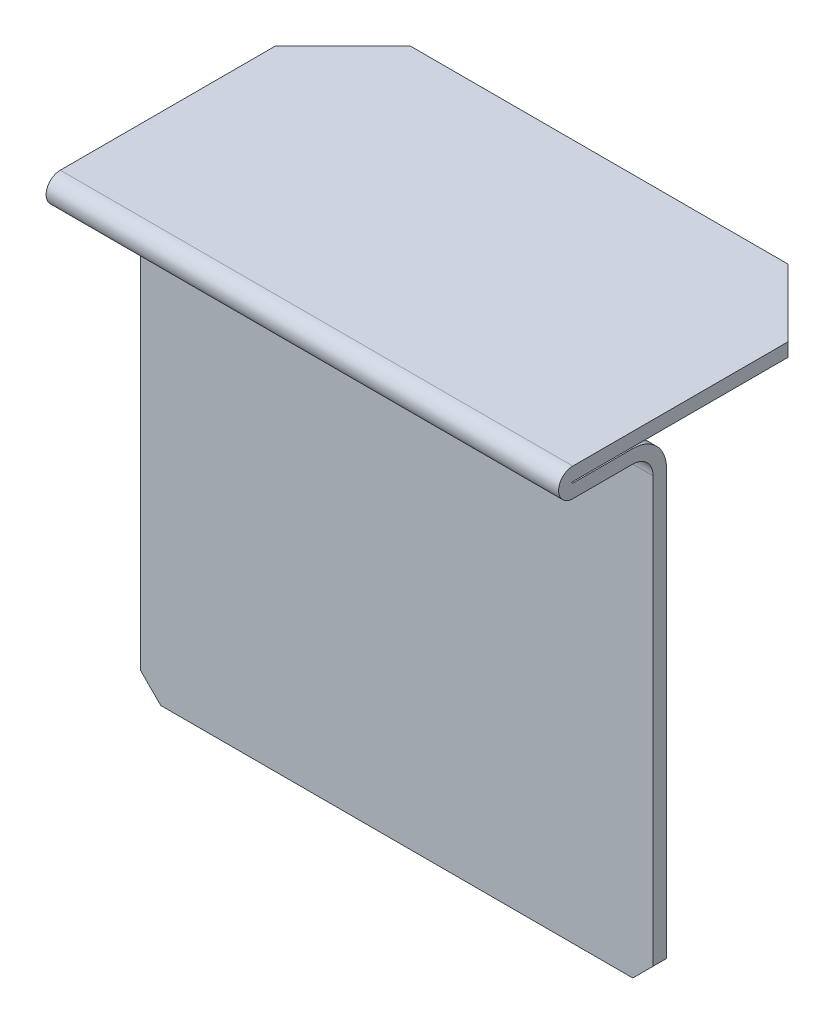
ISO-10303-21;
HEADER;
FILE_DESCRIPTION(('STEP AP214'),'2;1');
FILE_NAME('part.step','',(''),(''),'','','');
FILE_SCHEMA(('AUTOMOTIVE_DESIGN { 1 0 10303 214 1 1 1 1 }'));
ENDSEC;
DATA;
#1=APPLICATION_CONTEXT('core data for automotive mechanical design processes');
#2=APPLICATION_PROTOCOL_DEFINITION('international standard','automotive_design',2000,#1);
#3=PRODUCT_CONTEXT('',#1,'mechanical');
#4=PRODUCT('Part','Part','',(#3));
#5=PRODUCT_RELATED_PRODUCT_CATEGORY('part','',(#4));
#6=PRODUCT_DEFINITION_FORMATION('','',#4);
#7=PRODUCT_DEFINITION_CONTEXT('part definition',#1,'design');
#8=PRODUCT_DEFINITION('design','',#6,#7);
#9=PRODUCT_DEFINITION_SHAPE('','',#8);
#10=(LENGTH_UNIT() NAMED_UNIT(*) SI_UNIT(.MILLI.,.METRE.));
#11=(NAMED_UNIT(*) PLANE_ANGLE_UNIT() SI_UNIT($,.RADIAN.));
#12=(NAMED_UNIT(*) SI_UNIT($,.STERADIAN.) SOLID_ANGLE_UNIT());
#13=UNCERTAINTY_MEASURE_WITH_UNIT(LENGTH_MEASURE(1.E-05),#10,'distance_accuracy_value','');
#14=(GEOMETRIC_REPRESENTATION_CONTEXT(3) GLOBAL_UNCERTAINTY_ASSIGNED_CONTEXT((#13)) GLOBAL_UNIT_ASSIGNED_CONTEXT((#10,
#11,#12)) REPRESENTATION_CONTEXT('',''));
#15=CARTESIAN_POINT('',(0.,0.,0.));
#16=DIRECTION('',(0.,0.,1.));
#17=DIRECTION('',(1.,0.,0.));
#18=AXIS2_PLACEMENT_3D('',#15,#16,#17);
#19=CARTESIAN_POINT('',(38.,0.,0.));
#20=DIRECTION('',(0.,1.,0.));
#21=DIRECTION('',(0.,0.,1.));
#22=AXIS2_PLACEMENT_3D('',#19,#20,#21);
#23=PLANE('',#22);
#24=DIRECTION('',(-1.,0.,0.));
#25=VECTOR('',#24,1.);
#26=CARTESIAN_POINT('',(38.,0.,0.));
#27=LINE('',#26,#25);
#28=CARTESIAN_POINT('',(36.5,0.,0.));
#29=VERTEX_POINT('',#28);
#30=CARTESIAN_POINT('',(1.5,0.,0.));
#31=VERTEX_POINT('',#30);
#32=EDGE_CURVE('E195',#29,#31,#27,.T.);
#33=ORIENTED_EDGE('',*,*,#32,.T.);
#34=DIRECTION('',(0.,0.,-1.));
#35=VECTOR('',#34,1.);
#36=CARTESIAN_POINT('',(1.5,0.,0.));
#37=LINE('',#36,#35);
#38=CARTESIAN_POINT('',(1.5,0.,-1.));
#39=VERTEX_POINT('',#38);
#40=EDGE_CURVE('E263',#31,#39,#37,.T.);
#41=ORIENTED_EDGE('',*,*,#40,.T.);
#42=DIRECTION('',(-1.,0.,0.));
#43=VECTOR('',#42,1.);
#44=CARTESIAN_POINT('',(38.,0.,-1.));
#45=LINE('',#44,#43);
#46=CARTESIAN_POINT('',(36.5,0.,-1.));
#47=VERTEX_POINT('',#46);
#48=EDGE_CURVE('E170',#47,#39,#45,.T.);
#49=ORIENTED_EDGE('',*,*,#48,.F.);
#50=DIRECTION('',(0.,0.,1.));
#51=VECTOR('',#50,1.);
#52=CARTESIAN_POINT('',(36.5,0.,0.));
#53=LINE('',#52,#51);
#54=EDGE_CURVE('E261',#47,#29,#53,.T.);
#55=ORIENTED_EDGE('',*,*,#54,.T.);
#56=EDGE_LOOP('',(#33,#41,#49,#55));
#57=FACE_BOUND('',#56,.T.);
#58=ADVANCED_FACE('F37',(#57),#23,.F.);
#59=CARTESIAN_POINT('',(38.,0.,-1.));
#60=DIRECTION('',(0.,0.,1.));
#61=DIRECTION('',(0.,-1.,0.));
#62=AXIS2_PLACEMENT_3D('',#59,#60,#61);
#63=PLANE('',#62);
#64=ORIENTED_EDGE('',*,*,#48,.T.);
#65=DIRECTION('',(0.707106781186546,-0.707106781186549,0.));
#66=VECTOR('',#65,1.);
#67=CARTESIAN_POINT('',(1.5,0.,-1.));
#68=LINE('',#67,#66);
#69=CARTESIAN_POINT('',(0.,1.50000000000001,-1.));
#70=VERTEX_POINT('',#69);
#71=EDGE_CURVE('E268',#39,#70,#68,.F.);
#72=ORIENTED_EDGE('',*,*,#71,.T.);
#73=DIRECTION('',(0.,1.,0.));
#74=VECTOR('',#73,1.);
#75=CARTESIAN_POINT('',(0.,0.,-1.));
#76=LINE('',#75,#74);
#77=CARTESIAN_POINT('',(0.,33.,-1.00000000000001));
#78=VERTEX_POINT('',#77);
#79=EDGE_CURVE('E167',#70,#78,#76,.T.);
#80=ORIENTED_EDGE('',*,*,#79,.T.);
#81=DIRECTION('',(-1.,0.,0.));
#82=VECTOR('',#81,1.);
#83=CARTESIAN_POINT('',(38.,33.,-1.00000000000001));
#84=LINE('',#83,#82);
#85=CARTESIAN_POINT('',(38.,33.,-1.00000000000001));
#86=VERTEX_POINT('',#85);
#87=EDGE_CURVE('E164',#86,#78,#84,.T.);
#88=ORIENTED_EDGE('',*,*,#87,.F.);
#89=DIRECTION('',(0.,1.,0.));
#90=VECTOR('',#89,1.);
#91=CARTESIAN_POINT('',(38.,0.,-1.));
#92=LINE('',#91,#90);
#93=CARTESIAN_POINT('',(38.,1.5,-1.));
#94=VERTEX_POINT('',#93);
#95=EDGE_CURVE('E153',#94,#86,#92,.T.);
#96=ORIENTED_EDGE('',*,*,#95,.F.);
#97=DIRECTION('',(-0.707106781186549,-0.707106781186546,0.));
#98=VECTOR('',#97,1.);
#99=CARTESIAN_POINT('',(38.,1.5,-1.));
#100=LINE('',#99,#98);
#101=EDGE_CURVE('E266',#94,#47,#100,.T.);
#102=ORIENTED_EDGE('',*,*,#101,.T.);
#103=EDGE_LOOP('',(#64,#72,#80,#88,#96,#102));
#104=FACE_BOUND('',#103,.T.);
#105=ADVANCED_FACE('F166',(#104),#63,.F.);
#106=CARTESIAN_POINT('',(38.,33.,1.49999999999997));
#107=DIRECTION('',(-1.,0.,0.));
#108=DIRECTION('',(0.,0.,1.));
#109=AXIS2_PLACEMENT_3D('',#106,#107,#108);
#110=CYLINDRICAL_SURFACE('',#109,2.49999999999999);
#111=CARTESIAN_POINT('',(0.,33.,1.49999999999997));
#112=DIRECTION('',(1.,0.,0.));
#113=DIRECTION('',(0.,0.,-1.));
#114=AXIS2_PLACEMENT_3D('',#111,#112,#113);
#115=CIRCLE('',#114,2.49999999999999);
#116=CARTESIAN_POINT('',(0.,35.5,1.49999999999998));
#117=VERTEX_POINT('',#116);
#118=EDGE_CURVE('E197',#78,#117,#115,.T.);
#119=ORIENTED_EDGE('',*,*,#118,.T.);
#120=DIRECTION('',(-1.,0.,0.));
#121=VECTOR('',#120,1.);
#122=CARTESIAN_POINT('',(38.,35.5,1.49999999999998));
#123=LINE('',#122,#121);
#124=CARTESIAN_POINT('',(38.,35.5,1.49999999999998));
#125=VERTEX_POINT('',#124);
#126=EDGE_CURVE('E171',#125,#117,#123,.T.);
#127=ORIENTED_EDGE('',*,*,#126,.F.);
#128=CARTESIAN_POINT('',(38.,33.,1.49999999999997));
#129=DIRECTION('',(1.,0.,0.));
#130=DIRECTION('',(0.,0.,-1.));
#131=AXIS2_PLACEMENT_3D('',#128,#129,#130);
#132=CIRCLE('',#131,2.49999999999999);
#133=EDGE_CURVE('E157',#86,#125,#132,.T.);
#134=ORIENTED_EDGE('',*,*,#133,.F.);
#135=ORIENTED_EDGE('',*,*,#87,.T.);
#136=EDGE_LOOP('',(#119,#127,#134,#135));
#137=FACE_BOUND('',#136,.T.);
#138=ADVANCED_FACE('F173',(#137),#110,.T.);
#139=CARTESIAN_POINT('',(38.,35.5,1.49999999999998));
#140=DIRECTION('',(0.,-1.,0.));
#141=DIRECTION('',(0.,0.,-1.));
#142=AXIS2_PLACEMENT_3D('',#139,#140,#141);
#143=PLANE('',#142);
#144=DIRECTION('',(0.,0.,1.));
#145=VECTOR('',#144,1.);
#146=CARTESIAN_POINT('',(0.,35.5,1.49999999999998));
#147=LINE('',#146,#145);
#148=CARTESIAN_POINT('',(0.,35.5,5.95));
#149=VERTEX_POINT('',#148);
#150=EDGE_CURVE('E199',#117,#149,#147,.T.);
#151=ORIENTED_EDGE('',*,*,#150,.T.);
#152=DIRECTION('',(-1.,0.,0.));
#153=VECTOR('',#152,1.);
#154=CARTESIAN_POINT('',(38.,35.5,5.95));
#155=LINE('',#154,#153);
#156=CARTESIAN_POINT('',(38.,35.5,5.95));
#157=VERTEX_POINT('',#156);
#158=EDGE_CURVE('E238',#157,#149,#155,.T.);
#159=ORIENTED_EDGE('',*,*,#158,.F.);
#160=DIRECTION('',(0.,0.,1.));
#161=VECTOR('',#160,1.);
#162=CARTESIAN_POINT('',(38.,35.5,1.49999999999998));
#163=LINE('',#162,#161);
#164=EDGE_CURVE('E176',#125,#157,#163,.T.);
#165=ORIENTED_EDGE('',*,*,#164,.F.);
#166=ORIENTED_EDGE('',*,*,#126,.T.);
#167=EDGE_LOOP('',(#151,#159,#165,#166));
#168=FACE_BOUND('',#167,.T.);
#169=ADVANCED_FACE('F283',(#168),#143,.F.);
#170=CARTESIAN_POINT('',(38.,35.55,5.95));
#171=DIRECTION('',(-1.,0.,0.));
#172=DIRECTION('',(0.,0.,1.));
#173=AXIS2_PLACEMENT_3D('',#170,#171,#172);
#174=CYLINDRICAL_SURFACE('',#173,0.0500000000000014);
#175=CARTESIAN_POINT('',(0.,35.55,5.95));
#176=DIRECTION('',(-1.,0.,0.));
#177=DIRECTION('',(0.,0.,1.));
#178=AXIS2_PLACEMENT_3D('',#175,#176,#177);
#179=CIRCLE('',#178,0.0500000000000014);
#180=CARTESIAN_POINT('',(0.,35.6,5.95));
#181=VERTEX_POINT('',#180);
#182=EDGE_CURVE('E201',#149,#181,#179,.T.);
#183=ORIENTED_EDGE('',*,*,#182,.T.);
#184=DIRECTION('',(-1.,0.,0.));
#185=VECTOR('',#184,1.);
#186=CARTESIAN_POINT('',(38.,35.6,5.95));
#187=LINE('',#186,#185);
#188=CARTESIAN_POINT('',(38.,35.6,5.95));
#189=VERTEX_POINT('',#188);
#190=EDGE_CURVE('E235',#189,#181,#187,.T.);
#191=ORIENTED_EDGE('',*,*,#190,.F.);
#192=CARTESIAN_POINT('',(38.,35.55,5.95));
#193=DIRECTION('',(-1.,0.,0.));
#194=DIRECTION('',(0.,0.,1.));
#195=AXIS2_PLACEMENT_3D('',#192,#193,#194);
#196=CIRCLE('',#195,0.0500000000000014);
#197=EDGE_CURVE('E178',#157,#189,#196,.T.);
#198=ORIENTED_EDGE('',*,*,#197,.F.);
#199=ORIENTED_EDGE('',*,*,#158,.T.);
#200=EDGE_LOOP('',(#183,#191,#198,#199));
#201=FACE_BOUND('',#200,.T.);
#202=ADVANCED_FACE('F290',(#201),#174,.F.);
#203=CARTESIAN_POINT('',(38.,35.6,5.95));
#204=DIRECTION('',(0.,1.,0.));
#205=DIRECTION('',(0.,0.,1.));
#206=AXIS2_PLACEMENT_3D('',#203,#204,#205);
#207=PLANE('',#206);
#208=DIRECTION('',(0.,0.,-1.));
#209=VECTOR('',#208,1.);
#210=CARTESIAN_POINT('',(0.,35.6,5.95));
#211=LINE('',#210,#209);
#212=CARTESIAN_POINT('',(0.,35.6,-9.99999999999998));
#213=VERTEX_POINT('',#212);
#214=EDGE_CURVE('E203',#181,#213,#211,.T.);
#215=ORIENTED_EDGE('',*,*,#214,.T.);
#216=DIRECTION('',(-0.707106781186547,0.,0.707106781186548));
#217=VECTOR('',#216,1.);
#218=CARTESIAN_POINT('',(5.,35.6,-15.));
#219=LINE('',#218,#217);
#220=CARTESIAN_POINT('',(5.00000000000002,35.6,-15.));
#221=VERTEX_POINT('',#220);
#222=EDGE_CURVE('E256',#213,#221,#219,.F.);
#223=ORIENTED_EDGE('',*,*,#222,.T.);
#224=DIRECTION('',(-1.,0.,0.));
#225=VECTOR('',#224,1.);
#226=CARTESIAN_POINT('',(38.,35.6,-15.));
#227=LINE('',#226,#225);
#228=CARTESIAN_POINT('',(33.,35.6,-15.));
#229=VERTEX_POINT('',#228);
#230=EDGE_CURVE('E232',#229,#221,#227,.T.);
#231=ORIENTED_EDGE('',*,*,#230,.F.);
#232=DIRECTION('',(0.707106781186549,0.,0.707106781186546));
#233=VECTOR('',#232,1.);
#234=CARTESIAN_POINT('',(38.,35.6,-10.));
#235=LINE('',#234,#233);
#236=CARTESIAN_POINT('',(38.,35.6,-10.));
#237=VERTEX_POINT('',#236);
#238=EDGE_CURVE('E254',#229,#237,#235,.T.);
#239=ORIENTED_EDGE('',*,*,#238,.T.);
#240=DIRECTION('',(0.,0.,-1.));
#241=VECTOR('',#240,1.);
#242=CARTESIAN_POINT('',(38.,35.6,5.95));
#243=LINE('',#242,#241);
#244=EDGE_CURVE('E182',#189,#237,#243,.T.);
#245=ORIENTED_EDGE('',*,*,#244,.F.);
#246=ORIENTED_EDGE('',*,*,#190,.T.);
#247=EDGE_LOOP('',(#215,#223,#231,#239,#245,#246));
#248=FACE_BOUND('',#247,.T.);
#249=ADVANCED_FACE('F293',(#248),#207,.F.);
#250=CARTESIAN_POINT('',(38.,36.6,-15.));
#251=DIRECTION('',(0.,0.,1.));
#252=DIRECTION('',(0.,-1.,0.));
#253=AXIS2_PLACEMENT_3D('',#250,#251,#252);
#254=PLANE('',#253);
#255=ORIENTED_EDGE('',*,*,#230,.T.);
#256=DIRECTION('',(0.,1.,0.));
#257=VECTOR('',#256,1.);
#258=CARTESIAN_POINT('',(5.,36.6,-15.));
#259=LINE('',#258,#257);
#260=CARTESIAN_POINT('',(5.00000000000002,36.6,-15.));
#261=VERTEX_POINT('',#260);
#262=EDGE_CURVE('E245',#221,#261,#259,.T.);
#263=ORIENTED_EDGE('',*,*,#262,.T.);
#264=DIRECTION('',(-1.,0.,0.));
#265=VECTOR('',#264,1.);
#266=CARTESIAN_POINT('',(38.,36.6,-15.));
#267=LINE('',#266,#265);
#268=CARTESIAN_POINT('',(33.,36.6,-15.));
#269=VERTEX_POINT('',#268);
#270=EDGE_CURVE('E229',#269,#261,#267,.T.);
#271=ORIENTED_EDGE('',*,*,#270,.F.);
#272=DIRECTION('',(0.,-1.,0.));
#273=VECTOR('',#272,1.);
#274=CARTESIAN_POINT('',(33.,35.6,-15.));
#275=LINE('',#274,#273);
#276=EDGE_CURVE('E243',#269,#229,#275,.T.);
#277=ORIENTED_EDGE('',*,*,#276,.T.);
#278=EDGE_LOOP('',(#255,#263,#271,#277));
#279=FACE_BOUND('',#278,.T.);
#280=ADVANCED_FACE('F413',(#279),#254,.F.);
#281=CARTESIAN_POINT('',(38.,36.6,5.95));
#282=DIRECTION('',(0.,-1.,0.));
#283=DIRECTION('',(0.,0.,-1.));
#284=AXIS2_PLACEMENT_3D('',#281,#282,#283);
#285=PLANE('',#284);
#286=ORIENTED_EDGE('',*,*,#270,.T.);
#287=DIRECTION('',(0.707106781186547,0.,-0.707106781186548));
#288=VECTOR('',#287,1.);
#289=CARTESIAN_POINT('',(5.,36.6,-15.));
#290=LINE('',#289,#288);
#291=CARTESIAN_POINT('',(0.,36.6,-9.99999999999998));
#292=VERTEX_POINT('',#291);
#293=EDGE_CURVE('E250',#261,#292,#290,.F.);
#294=ORIENTED_EDGE('',*,*,#293,.T.);
#295=DIRECTION('',(0.,0.,1.));
#296=VECTOR('',#295,1.);
#297=CARTESIAN_POINT('',(0.,36.6,5.95));
#298=LINE('',#297,#296);
#299=CARTESIAN_POINT('',(0.,36.6,5.95));
#300=VERTEX_POINT('',#299);
#301=EDGE_CURVE('E206',#292,#300,#298,.T.);
#302=ORIENTED_EDGE('',*,*,#301,.T.);
#303=DIRECTION('',(-1.,0.,0.));
#304=VECTOR('',#303,1.);
#305=CARTESIAN_POINT('',(38.,36.6,5.95));
#306=LINE('',#305,#304);
#307=CARTESIAN_POINT('',(38.,36.6,5.95));
#308=VERTEX_POINT('',#307);
#309=EDGE_CURVE('E226',#308,#300,#306,.T.);
#310=ORIENTED_EDGE('',*,*,#309,.F.);
#311=DIRECTION('',(0.,0.,1.));
#312=VECTOR('',#311,1.);
#313=CARTESIAN_POINT('',(38.,36.6,5.95));
#314=LINE('',#313,#312);
#315=CARTESIAN_POINT('',(38.,36.6,-10.));
#316=VERTEX_POINT('',#315);
#317=EDGE_CURVE('E185',#316,#308,#314,.T.);
#318=ORIENTED_EDGE('',*,*,#317,.F.);
#319=DIRECTION('',(-0.707106781186549,0.,-0.707106781186546));
#320=VECTOR('',#319,1.);
#321=CARTESIAN_POINT('',(38.,36.6,-10.));
#322=LINE('',#321,#320);
#323=EDGE_CURVE('E248',#316,#269,#322,.T.);
#324=ORIENTED_EDGE('',*,*,#323,.T.);
#325=EDGE_LOOP('',(#286,#294,#302,#310,#318,#324));
#326=FACE_BOUND('',#325,.T.);
#327=ADVANCED_FACE('F302',(#326),#285,.F.);
#328=CARTESIAN_POINT('',(38.,35.55,5.95));
#329=DIRECTION('',(-1.,0.,0.));
#330=DIRECTION('',(0.,0.,1.));
#331=AXIS2_PLACEMENT_3D('',#328,#329,#330);
#332=CYLINDRICAL_SURFACE('',#331,1.05);
#333=CARTESIAN_POINT('',(0.,35.55,5.95));
#334=DIRECTION('',(1.,0.,0.));
#335=DIRECTION('',(0.,0.,1.));
#336=AXIS2_PLACEMENT_3D('',#333,#334,#335);
#337=CIRCLE('',#336,1.05);
#338=CARTESIAN_POINT('',(0.,34.5,5.95));
#339=VERTEX_POINT('',#338);
#340=EDGE_CURVE('E208',#300,#339,#337,.T.);
#341=ORIENTED_EDGE('',*,*,#340,.T.);
#342=DIRECTION('',(-1.,0.,0.));
#343=VECTOR('',#342,1.);
#344=CARTESIAN_POINT('',(38.,34.5,5.95));
#345=LINE('',#344,#343);
#346=CARTESIAN_POINT('',(38.,34.5,5.95));
#347=VERTEX_POINT('',#346);
#348=EDGE_CURVE('E223',#347,#339,#345,.T.);
#349=ORIENTED_EDGE('',*,*,#348,.F.);
#350=CARTESIAN_POINT('',(38.,35.55,5.95));
#351=DIRECTION('',(1.,0.,0.));
#352=DIRECTION('',(0.,0.,1.));
#353=AXIS2_PLACEMENT_3D('',#350,#351,#352);
#354=CIRCLE('',#353,1.05);
#355=EDGE_CURVE('E187',#308,#347,#354,.T.);
#356=ORIENTED_EDGE('',*,*,#355,.F.);
#357=ORIENTED_EDGE('',*,*,#309,.T.);
#358=EDGE_LOOP('',(#341,#349,#356,#357));
#359=FACE_BOUND('',#358,.T.);
#360=ADVANCED_FACE('F309',(#359),#332,.T.);
#361=CARTESIAN_POINT('',(38.,34.5,1.49999999999997));
#362=DIRECTION('',(0.,1.,0.));
#363=DIRECTION('',(0.,0.,1.));
#364=AXIS2_PLACEMENT_3D('',#361,#362,#363);
#365=PLANE('',#364);
#366=DIRECTION('',(0.,0.,-1.));
#367=VECTOR('',#366,1.);
#368=CARTESIAN_POINT('',(0.,34.5,1.49999999999997));
#369=LINE('',#368,#367);
#370=CARTESIAN_POINT('',(0.,34.5,1.49999999999997));
#371=VERTEX_POINT('',#370);
#372=EDGE_CURVE('E210',#339,#371,#369,.T.);
#373=ORIENTED_EDGE('',*,*,#372,.T.);
#374=DIRECTION('',(-1.,0.,0.));
#375=VECTOR('',#374,1.);
#376=CARTESIAN_POINT('',(38.,34.5,1.49999999999997));
#377=LINE('',#376,#375);
#378=CARTESIAN_POINT('',(38.,34.5,1.49999999999997));
#379=VERTEX_POINT('',#378);
#380=EDGE_CURVE('E220',#379,#371,#377,.T.);
#381=ORIENTED_EDGE('',*,*,#380,.F.);
#382=DIRECTION('',(0.,0.,-1.));
#383=VECTOR('',#382,1.);
#384=CARTESIAN_POINT('',(38.,34.5,1.49999999999997));
#385=LINE('',#384,#383);
#386=EDGE_CURVE('E189',#347,#379,#385,.T.);
#387=ORIENTED_EDGE('',*,*,#386,.F.);
#388=ORIENTED_EDGE('',*,*,#348,.T.);
#389=EDGE_LOOP('',(#373,#381,#387,#388));
#390=FACE_BOUND('',#389,.T.);
#391=ADVANCED_FACE('F315',(#390),#365,.F.);
#392=CARTESIAN_POINT('',(38.,33.,1.49999999999997));
#393=DIRECTION('',(-1.,0.,0.));
#394=DIRECTION('',(0.,0.,1.));
#395=AXIS2_PLACEMENT_3D('',#392,#393,#394);
#396=CYLINDRICAL_SURFACE('',#395,1.49999999999999);
#397=CARTESIAN_POINT('',(0.,33.,1.49999999999997));
#398=DIRECTION('',(-1.,0.,0.));
#399=DIRECTION('',(0.,0.,-1.));
#400=AXIS2_PLACEMENT_3D('',#397,#398,#399);
#401=CIRCLE('',#400,1.49999999999999);
#402=CARTESIAN_POINT('',(0.,33.,0.));
#403=VERTEX_POINT('',#402);
#404=EDGE_CURVE('E212',#371,#403,#401,.T.);
#405=ORIENTED_EDGE('',*,*,#404,.T.);
#406=DIRECTION('',(-1.,0.,0.));
#407=VECTOR('',#406,1.);
#408=CARTESIAN_POINT('',(38.,33.,0.));
#409=LINE('',#408,#407);
#410=CARTESIAN_POINT('',(38.,33.,0.));
#411=VERTEX_POINT('',#410);
#412=EDGE_CURVE('E217',#411,#403,#409,.T.);
#413=ORIENTED_EDGE('',*,*,#412,.F.);
#414=CARTESIAN_POINT('',(38.,33.,1.49999999999997));
#415=DIRECTION('',(-1.,0.,0.));
#416=DIRECTION('',(0.,0.,-1.));
#417=AXIS2_PLACEMENT_3D('',#414,#415,#416);
#418=CIRCLE('',#417,1.49999999999999);
#419=EDGE_CURVE('E191',#379,#411,#418,.T.);
#420=ORIENTED_EDGE('',*,*,#419,.F.);
#421=ORIENTED_EDGE('',*,*,#380,.T.);
#422=EDGE_LOOP('',(#405,#413,#420,#421));
#423=FACE_BOUND('',#422,.T.);
#424=ADVANCED_FACE('F319',(#423),#396,.F.);
#425=CARTESIAN_POINT('',(38.,0.,0.));
#426=DIRECTION('',(0.,0.,-1.));
#427=DIRECTION('',(-1.,0.,0.));
#428=AXIS2_PLACEMENT_3D('',#425,#426,#427);
#429=PLANE('',#428);
#430=DIRECTION('',(0.,-1.,0.));
#431=VECTOR('',#430,1.);
#432=CARTESIAN_POINT('',(0.,0.,0.));
#433=LINE('',#432,#431);
#434=CARTESIAN_POINT('',(0.,1.50000000000001,0.));
#435=VERTEX_POINT('',#434);
#436=EDGE_CURVE('E161',#403,#435,#433,.T.);
#437=ORIENTED_EDGE('',*,*,#436,.T.);
#438=DIRECTION('',(-0.707106781186546,0.707106781186549,0.));
#439=VECTOR('',#438,1.);
#440=CARTESIAN_POINT('',(1.5,0.,0.));
#441=LINE('',#440,#439);
#442=EDGE_CURVE('E45',#435,#31,#441,.F.);
#443=ORIENTED_EDGE('',*,*,#442,.T.);
#444=ORIENTED_EDGE('',*,*,#32,.F.);
#445=DIRECTION('',(0.707106781186549,0.707106781186546,0.));
#446=VECTOR('',#445,1.);
#447=CARTESIAN_POINT('',(38.,1.5,0.));
#448=LINE('',#447,#446);
#449=CARTESIAN_POINT('',(38.,1.5,0.));
#450=VERTEX_POINT('',#449);
#451=EDGE_CURVE('E52',#29,#450,#448,.T.);
#452=ORIENTED_EDGE('',*,*,#451,.T.);
#453=DIRECTION('',(0.,-1.,0.));
#454=VECTOR('',#453,1.);
#455=CARTESIAN_POINT('',(38.,0.,0.));
#456=LINE('',#455,#454);
#457=EDGE_CURVE('E193',#411,#450,#456,.T.);
#458=ORIENTED_EDGE('',*,*,#457,.F.);
#459=ORIENTED_EDGE('',*,*,#412,.T.);
#460=EDGE_LOOP('',(#437,#443,#444,#452,#458,#459));
#461=FACE_BOUND('',#460,.T.);
#462=ADVANCED_FACE('F272',(#461),#429,.F.);
#463=CARTESIAN_POINT('',(38.,33.,1.49999999999997));
#464=DIRECTION('',(1.,0.,0.));
#465=DIRECTION('',(0.,0.,-1.));
#466=AXIS2_PLACEMENT_3D('',#463,#464,#465);
#467=PLANE('',#466);
#468=ORIENTED_EDGE('',*,*,#457,.T.);
#469=DIRECTION('',(0.,0.,-1.));
#470=VECTOR('',#469,1.);
#471=CARTESIAN_POINT('',(38.,1.5,-1.));
#472=LINE('',#471,#470);
#473=EDGE_CURVE('E11',#450,#94,#472,.T.);
#474=ORIENTED_EDGE('',*,*,#473,.T.);
#475=ORIENTED_EDGE('',*,*,#95,.T.);
#476=ORIENTED_EDGE('',*,*,#133,.T.);
#477=ORIENTED_EDGE('',*,*,#164,.T.);
#478=ORIENTED_EDGE('',*,*,#197,.T.);
#479=ORIENTED_EDGE('',*,*,#244,.T.);
#480=DIRECTION('',(0.,1.,0.));
#481=VECTOR('',#480,1.);
#482=CARTESIAN_POINT('',(38.,36.6,-9.99999999999999));
#483=LINE('',#482,#481);
#484=EDGE_CURVE('E258',#237,#316,#483,.T.);
#485=ORIENTED_EDGE('',*,*,#484,.T.);
#486=ORIENTED_EDGE('',*,*,#317,.T.);
#487=ORIENTED_EDGE('',*,*,#355,.T.);
#488=ORIENTED_EDGE('',*,*,#386,.T.);
#489=ORIENTED_EDGE('',*,*,#419,.T.);
#490=EDGE_LOOP('',(#468,#474,#475,#476,#477,#478,#479,#485,#486,#487,#488,#489));
#491=FACE_BOUND('',#490,.T.);
#492=ADVANCED_FACE('F155',(#491),#467,.T.);
#493=CARTESIAN_POINT('',(0.,33.,1.49999999999997));
#494=DIRECTION('',(1.,0.,0.));
#495=DIRECTION('',(0.,0.,-1.));
#496=AXIS2_PLACEMENT_3D('',#493,#494,#495);
#497=PLANE('',#496);
#498=ORIENTED_EDGE('',*,*,#79,.F.);
#499=DIRECTION('',(0.,0.,1.));
#500=VECTOR('',#499,1.);
#501=CARTESIAN_POINT('',(0.,1.50000000000001,1.49999999999997));
#502=LINE('',#501,#500);
#503=EDGE_CURVE('E60',#70,#435,#502,.T.);
#504=ORIENTED_EDGE('',*,*,#503,.T.);
#505=ORIENTED_EDGE('',*,*,#436,.F.);
#506=ORIENTED_EDGE('',*,*,#404,.F.);
#507=ORIENTED_EDGE('',*,*,#372,.F.);
#508=ORIENTED_EDGE('',*,*,#340,.F.);
#509=ORIENTED_EDGE('',*,*,#301,.F.);
#510=DIRECTION('',(0.,-1.,0.));
#511=VECTOR('',#510,1.);
#512=CARTESIAN_POINT('',(0.,33.,-9.99999999999999));
#513=LINE('',#512,#511);
#514=EDGE_CURVE('E252',#292,#213,#513,.T.);
#515=ORIENTED_EDGE('',*,*,#514,.T.);
#516=ORIENTED_EDGE('',*,*,#214,.F.);
#517=ORIENTED_EDGE('',*,*,#182,.F.);
#518=ORIENTED_EDGE('',*,*,#150,.F.);
#519=ORIENTED_EDGE('',*,*,#118,.F.);
#520=EDGE_LOOP('',(#498,#504,#505,#506,#507,#508,#509,#515,#516,#517,#518,#519));
#521=FACE_BOUND('',#520,.T.);
#522=ADVANCED_FACE('F279',(#521),#497,.F.);
#523=CARTESIAN_POINT('',(5.,36.6,-15.));
#524=DIRECTION('',(0.707106781186548,0.,0.707106781186547));
#525=DIRECTION('',(0.,1.,0.));
#526=AXIS2_PLACEMENT_3D('',#523,#524,#525);
#527=PLANE('',#526);
#528=ORIENTED_EDGE('',*,*,#222,.F.);
#529=ORIENTED_EDGE('',*,*,#514,.F.);
#530=ORIENTED_EDGE('',*,*,#293,.F.);
#531=ORIENTED_EDGE('',*,*,#262,.F.);
#532=EDGE_LOOP('',(#528,#529,#530,#531));
#533=FACE_BOUND('',#532,.T.);
#534=ADVANCED_FACE('F333',(#533),#527,.F.);
#535=CARTESIAN_POINT('',(38.,33.,-10.));
#536=DIRECTION('',(0.707106781186546,0.,-0.707106781186549));
#537=DIRECTION('',(0.,-1.,0.));
#538=AXIS2_PLACEMENT_3D('',#535,#536,#537);
#539=PLANE('',#538);
#540=ORIENTED_EDGE('',*,*,#238,.F.);
#541=ORIENTED_EDGE('',*,*,#276,.F.);
#542=ORIENTED_EDGE('',*,*,#323,.F.);
#543=ORIENTED_EDGE('',*,*,#484,.F.);
#544=EDGE_LOOP('',(#540,#541,#542,#543));
#545=FACE_BOUND('',#544,.T.);
#546=ADVANCED_FACE('F298',(#545),#539,.T.);
#547=CARTESIAN_POINT('',(1.5,0.,0.));
#548=DIRECTION('',(0.707106781186549,0.707106781186546,0.));
#549=DIRECTION('',(0.,0.,-1.));
#550=AXIS2_PLACEMENT_3D('',#547,#548,#549);
#551=PLANE('',#550);
#552=ORIENTED_EDGE('',*,*,#442,.F.);
#553=ORIENTED_EDGE('',*,*,#503,.F.);
#554=ORIENTED_EDGE('',*,*,#71,.F.);
#555=ORIENTED_EDGE('',*,*,#40,.F.);
#556=EDGE_LOOP('',(#552,#553,#554,#555));
#557=FACE_BOUND('',#556,.T.);
#558=ADVANCED_FACE('F278',(#557),#551,.F.);
#559=CARTESIAN_POINT('',(38.,1.5,1.49999999999997));
#560=DIRECTION('',(0.707106781186546,-0.707106781186549,0.));
#561=DIRECTION('',(0.,0.,1.));
#562=AXIS2_PLACEMENT_3D('',#559,#560,#561);
#563=PLANE('',#562);
#564=ORIENTED_EDGE('',*,*,#451,.F.);
#565=ORIENTED_EDGE('',*,*,#54,.F.);
#566=ORIENTED_EDGE('',*,*,#101,.F.);
#567=ORIENTED_EDGE('',*,*,#473,.F.);
#568=EDGE_LOOP('',(#564,#565,#566,#567));
#569=FACE_BOUND('',#568,.T.);
#570=ADVANCED_FACE('F39',(#569),#563,.T.);
#571=CLOSED_SHELL('',(#58,#105,#138,#169,#202,#249,#280,#327,#360,#391,#424,#462,#492,#522,#534,
#546,#558,#570));
#572=MANIFOLD_SOLID_BREP('B2',#571);
#573=ADVANCED_BREP_SHAPE_REPRESENTATION('',(#18,#572),#14);
#574=SHAPE_DEFINITION_REPRESENTATION(#9,#573);
ENDSEC;
END-ISO-10303-21;
